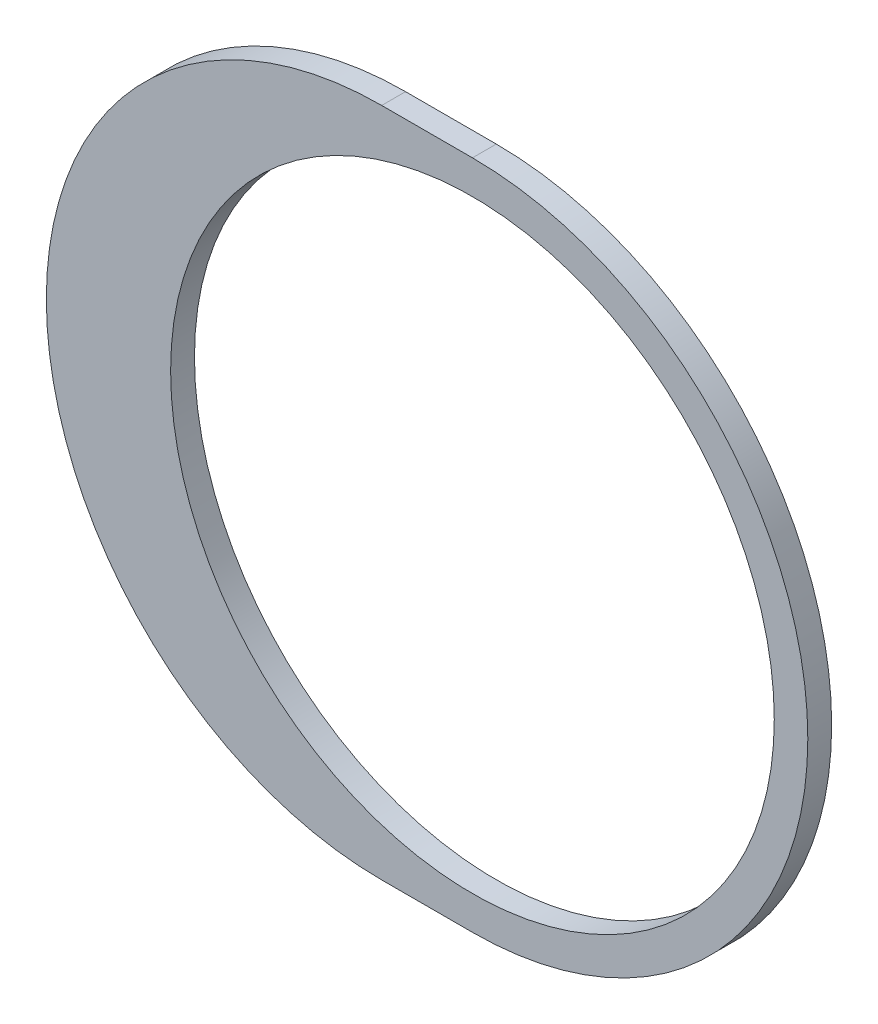
ISO-10303-21;
HEADER;
FILE_DESCRIPTION(('STEP AP214'),'2;1');
FILE_NAME('part.step','',(''),(''),'','','');
FILE_SCHEMA(('AUTOMOTIVE_DESIGN { 1 0 10303 214 1 1 1 1 }'));
ENDSEC;
DATA;
#1=APPLICATION_CONTEXT('core data for automotive mechanical design processes');
#2=APPLICATION_PROTOCOL_DEFINITION('international standard','automotive_design',2000,#1);
#3=PRODUCT_CONTEXT('',#1,'mechanical');
#4=PRODUCT('Part','Part','',(#3));
#5=PRODUCT_RELATED_PRODUCT_CATEGORY('part','',(#4));
#6=PRODUCT_DEFINITION_FORMATION('','',#4);
#7=PRODUCT_DEFINITION_CONTEXT('part definition',#1,'design');
#8=PRODUCT_DEFINITION('design','',#6,#7);
#9=PRODUCT_DEFINITION_SHAPE('','',#8);
#10=(LENGTH_UNIT() NAMED_UNIT(*) SI_UNIT(.MILLI.,.METRE.));
#11=(NAMED_UNIT(*) PLANE_ANGLE_UNIT() SI_UNIT($,.RADIAN.));
#12=(NAMED_UNIT(*) SI_UNIT($,.STERADIAN.) SOLID_ANGLE_UNIT());
#13=UNCERTAINTY_MEASURE_WITH_UNIT(LENGTH_MEASURE(1.E-05),#10,'distance_accuracy_value','');
#14=(GEOMETRIC_REPRESENTATION_CONTEXT(3) GLOBAL_UNCERTAINTY_ASSIGNED_CONTEXT((#13)) GLOBAL_UNIT_ASSIGNED_CONTEXT((#10,
#11,#12)) REPRESENTATION_CONTEXT('',''));
#15=CARTESIAN_POINT('',(0.,0.,0.));
#16=DIRECTION('',(0.,0.,1.));
#17=DIRECTION('',(1.,0.,0.));
#18=AXIS2_PLACEMENT_3D('',#15,#16,#17);
#19=CARTESIAN_POINT('',(68.7647088,40.5400002,0.));
#20=DIRECTION('',(0.,1.,0.));
#21=DIRECTION('',(1.,0.,0.));
#22=AXIS2_PLACEMENT_3D('',#19,#20,#21);
#23=PLANE('',#22);
#24=DIRECTION('',(1.,0.,0.));
#25=VECTOR('',#24,1.);
#26=CARTESIAN_POINT('',(68.7647088,40.5400002,0.03556));
#27=LINE('',#26,#25);
#28=CARTESIAN_POINT('',(68.7647088,40.5400002,0.03556));
#29=VERTEX_POINT('',#28);
#30=CARTESIAN_POINT('',(68.8999892,40.5400002,0.03556));
#31=VERTEX_POINT('',#30);
#32=EDGE_CURVE('E11',#29,#31,#27,.T.);
#33=ORIENTED_EDGE('',*,*,#32,.F.);
#34=DIRECTION('',(0.,0.,1.));
#35=VECTOR('',#34,1.);
#36=CARTESIAN_POINT('',(68.7647088,40.5400002,0.));
#37=LINE('',#36,#35);
#38=CARTESIAN_POINT('',(68.7647088,40.5400002,0.));
#39=VERTEX_POINT('',#38);
#40=EDGE_CURVE('E24',#39,#29,#37,.T.);
#41=ORIENTED_EDGE('',*,*,#40,.F.);
#42=DIRECTION('',(1.,0.,0.));
#43=VECTOR('',#42,1.);
#44=CARTESIAN_POINT('',(68.7647088,40.5400002,0.));
#45=LINE('',#44,#43);
#46=CARTESIAN_POINT('',(68.8999892,40.5400002,0.));
#47=VERTEX_POINT('',#46);
#48=EDGE_CURVE('E96',#39,#47,#45,.T.);
#49=ORIENTED_EDGE('',*,*,#48,.T.);
#50=DIRECTION('',(0.,0.,1.));
#51=VECTOR('',#50,1.);
#52=CARTESIAN_POINT('',(68.8999892,40.5400002,0.));
#53=LINE('',#52,#51);
#54=EDGE_CURVE('E37',#47,#31,#53,.T.);
#55=ORIENTED_EDGE('',*,*,#54,.T.);
#56=EDGE_LOOP('',(#33,#41,#49,#55));
#57=FACE_BOUND('',#56,.T.);
#58=ADVANCED_FACE('F17',(#57),#23,.F.);
#59=CARTESIAN_POINT('',(68.7647088,41.0399992,0.));
#60=DIRECTION('',(0.,0.,-1.));
#61=DIRECTION('',(0.,1.,0.));
#62=AXIS2_PLACEMENT_3D('',#59,#60,#61);
#63=CYLINDRICAL_SURFACE('',#62,0.499998999999998);
#64=CARTESIAN_POINT('',(68.7647088,41.0399992,0.03556));
#65=DIRECTION('',(0.,0.,1.));
#66=DIRECTION('',(0.,1.,0.));
#67=AXIS2_PLACEMENT_3D('',#64,#65,#66);
#68=CIRCLE('',#67,0.499998999999998);
#69=CARTESIAN_POINT('',(68.7647088,41.5399982,0.03556));
#70=VERTEX_POINT('',#69);
#71=EDGE_CURVE('E92',#70,#29,#68,.T.);
#72=ORIENTED_EDGE('',*,*,#71,.F.);
#73=DIRECTION('',(0.,0.,1.));
#74=VECTOR('',#73,1.);
#75=CARTESIAN_POINT('',(68.7647088,41.5399982,0.));
#76=LINE('',#75,#74);
#77=CARTESIAN_POINT('',(68.7647088,41.5399982,0.));
#78=VERTEX_POINT('',#77);
#79=EDGE_CURVE('E90',#78,#70,#76,.T.);
#80=ORIENTED_EDGE('',*,*,#79,.F.);
#81=CARTESIAN_POINT('',(68.7647088,41.0399992,0.));
#82=DIRECTION('',(0.,0.,1.));
#83=DIRECTION('',(0.,1.,0.));
#84=AXIS2_PLACEMENT_3D('',#81,#82,#83);
#85=CIRCLE('',#84,0.499998999999998);
#86=EDGE_CURVE('E88',#78,#39,#85,.T.);
#87=ORIENTED_EDGE('',*,*,#86,.T.);
#88=ORIENTED_EDGE('',*,*,#40,.T.);
#89=EDGE_LOOP('',(#72,#80,#87,#88));
#90=FACE_BOUND('',#89,.T.);
#91=ADVANCED_FACE('F111',(#90),#63,.T.);
#92=CARTESIAN_POINT('',(68.8999892,41.0399992,0.));
#93=DIRECTION('',(0.,0.,-1.));
#94=DIRECTION('',(0.,-1.,0.));
#95=AXIS2_PLACEMENT_3D('',#92,#93,#94);
#96=CYLINDRICAL_SURFACE('',#95,0.499999000000002);
#97=CARTESIAN_POINT('',(68.8999892,41.0399992,0.03556));
#98=DIRECTION('',(0.,0.,1.));
#99=DIRECTION('',(0.,-1.,0.));
#100=AXIS2_PLACEMENT_3D('',#97,#98,#99);
#101=CIRCLE('',#100,0.499999000000002);
#102=CARTESIAN_POINT('',(68.8999892,41.5399982,0.03556));
#103=VERTEX_POINT('',#102);
#104=EDGE_CURVE('E85',#31,#103,#101,.T.);
#105=ORIENTED_EDGE('',*,*,#104,.F.);
#106=ORIENTED_EDGE('',*,*,#54,.F.);
#107=CARTESIAN_POINT('',(68.8999892,41.0399992,0.));
#108=DIRECTION('',(0.,0.,1.));
#109=DIRECTION('',(0.,-1.,0.));
#110=AXIS2_PLACEMENT_3D('',#107,#108,#109);
#111=CIRCLE('',#110,0.499999000000002);
#112=CARTESIAN_POINT('',(68.8999892,41.5399982,0.));
#113=VERTEX_POINT('',#112);
#114=EDGE_CURVE('E82',#47,#113,#111,.T.);
#115=ORIENTED_EDGE('',*,*,#114,.T.);
#116=DIRECTION('',(0.,0.,1.));
#117=VECTOR('',#116,1.);
#118=CARTESIAN_POINT('',(68.8999892,41.5399982,0.));
#119=LINE('',#118,#117);
#120=EDGE_CURVE('E80',#113,#103,#119,.T.);
#121=ORIENTED_EDGE('',*,*,#120,.T.);
#122=EDGE_LOOP('',(#105,#106,#115,#121));
#123=FACE_BOUND('',#122,.T.);
#124=ADVANCED_FACE('F104',(#123),#96,.T.);
#125=CARTESIAN_POINT('',(68.8999892,41.5399982,0.));
#126=DIRECTION('',(0.,-1.,0.));
#127=DIRECTION('',(-1.,0.,0.));
#128=AXIS2_PLACEMENT_3D('',#125,#126,#127);
#129=PLANE('',#128);
#130=DIRECTION('',(-1.,0.,0.));
#131=VECTOR('',#130,1.);
#132=CARTESIAN_POINT('',(68.8999892,41.5399982,0.03556));
#133=LINE('',#132,#131);
#134=EDGE_CURVE('E77',#103,#70,#133,.T.);
#135=ORIENTED_EDGE('',*,*,#134,.F.);
#136=ORIENTED_EDGE('',*,*,#120,.F.);
#137=DIRECTION('',(-1.,0.,0.));
#138=VECTOR('',#137,1.);
#139=CARTESIAN_POINT('',(68.8999892,41.5399982,0.));
#140=LINE('',#139,#138);
#141=EDGE_CURVE('E68',#113,#78,#140,.T.);
#142=ORIENTED_EDGE('',*,*,#141,.T.);
#143=ORIENTED_EDGE('',*,*,#79,.T.);
#144=EDGE_LOOP('',(#135,#136,#142,#143));
#145=FACE_BOUND('',#144,.T.);
#146=ADVANCED_FACE('F110',(#145),#129,.F.);
#147=CARTESIAN_POINT('',(68.8999892,41.0399992,0.));
#148=DIRECTION('',(0.,0.,-1.));
#149=DIRECTION('',(1.,0.,0.));
#150=AXIS2_PLACEMENT_3D('',#147,#148,#149);
#151=CYLINDRICAL_SURFACE('',#150,0.4499991);
#152=DIRECTION('',(0.,0.,1.));
#153=VECTOR('',#152,1.);
#154=CARTESIAN_POINT('',(69.3499883,41.0399992,0.));
#155=LINE('',#154,#153);
#156=CARTESIAN_POINT('',(69.3499883,41.0399992,0.));
#157=VERTEX_POINT('',#156);
#158=CARTESIAN_POINT('',(69.3499883,41.0399992,0.03556));
#159=VERTEX_POINT('',#158);
#160=EDGE_CURVE('E62',#157,#159,#155,.T.);
#161=ORIENTED_EDGE('',*,*,#160,.T.);
#162=CARTESIAN_POINT('',(68.8999892,41.0399992,0.03556));
#163=DIRECTION('',(0.,0.,1.));
#164=DIRECTION('',(1.,0.,0.));
#165=AXIS2_PLACEMENT_3D('',#162,#163,#164);
#166=CIRCLE('',#165,0.4499991);
#167=EDGE_CURVE('E67',#159,#159,#166,.T.);
#168=ORIENTED_EDGE('',*,*,#167,.T.);
#169=ORIENTED_EDGE('',*,*,#160,.F.);
#170=CARTESIAN_POINT('',(68.8999892,41.0399992,0.));
#171=DIRECTION('',(0.,0.,1.));
#172=DIRECTION('',(1.,0.,0.));
#173=AXIS2_PLACEMENT_3D('',#170,#171,#172);
#174=CIRCLE('',#173,0.4499991);
#175=EDGE_CURVE('E65',#157,#157,#174,.T.);
#176=ORIENTED_EDGE('',*,*,#175,.F.);
#177=EDGE_LOOP('',(#161,#168,#169,#176));
#178=FACE_BOUND('',#177,.T.);
#179=ADVANCED_FACE('F64',(#178),#151,.F.);
#180=CARTESIAN_POINT('',(68.7647088,40.5400002,0.));
#181=DIRECTION('',(0.,0.,-1.));
#182=DIRECTION('',(-1.,0.,0.));
#183=AXIS2_PLACEMENT_3D('',#180,#181,#182);
#184=PLANE('',#183);
#185=ORIENTED_EDGE('',*,*,#48,.F.);
#186=ORIENTED_EDGE('',*,*,#86,.F.);
#187=ORIENTED_EDGE('',*,*,#141,.F.);
#188=ORIENTED_EDGE('',*,*,#114,.F.);
#189=EDGE_LOOP('',(#185,#186,#187,#188));
#190=FACE_BOUND('',#189,.T.);
#191=ORIENTED_EDGE('',*,*,#175,.T.);
#192=EDGE_LOOP('',(#191));
#193=FACE_BOUND('',#192,.T.);
#194=ADVANCED_FACE('F71',(#190,#193),#184,.T.);
#195=CARTESIAN_POINT('',(68.7647088,40.5400002,0.03556));
#196=DIRECTION('',(0.,0.,-1.));
#197=DIRECTION('',(-1.,0.,0.));
#198=AXIS2_PLACEMENT_3D('',#195,#196,#197);
#199=PLANE('',#198);
#200=ORIENTED_EDGE('',*,*,#134,.T.);
#201=ORIENTED_EDGE('',*,*,#71,.T.);
#202=ORIENTED_EDGE('',*,*,#32,.T.);
#203=ORIENTED_EDGE('',*,*,#104,.T.);
#204=EDGE_LOOP('',(#200,#201,#202,#203));
#205=FACE_BOUND('',#204,.T.);
#206=ORIENTED_EDGE('',*,*,#167,.F.);
#207=EDGE_LOOP('',(#206));
#208=FACE_BOUND('',#207,.T.);
#209=ADVANCED_FACE('F107',(#205,#208),#199,.F.);
#210=CLOSED_SHELL('',(#58,#91,#124,#146,#179,#194,#209));
#211=MANIFOLD_SOLID_BREP('B1',#210);
#212=ADVANCED_BREP_SHAPE_REPRESENTATION('',(#18,#211),#14);
#213=SHAPE_DEFINITION_REPRESENTATION(#9,#212);
ENDSEC;
END-ISO-10303-21;
